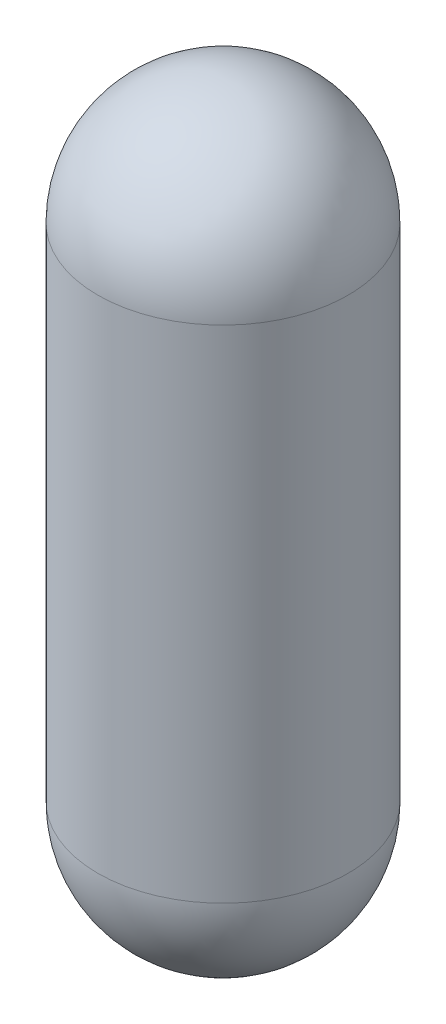
ISO-10303-21;
HEADER;
FILE_DESCRIPTION(('STEP AP214'),'2;1');
FILE_NAME('part.step','',(''),(''),'','','');
FILE_SCHEMA(('AUTOMOTIVE_DESIGN { 1 0 10303 214 1 1 1 1 }'));
ENDSEC;
DATA;
#1=APPLICATION_CONTEXT('core data for automotive mechanical design processes');
#2=APPLICATION_PROTOCOL_DEFINITION('international standard','automotive_design',2000,#1);
#3=PRODUCT_CONTEXT('',#1,'mechanical');
#4=PRODUCT('Part','Part','',(#3));
#5=PRODUCT_RELATED_PRODUCT_CATEGORY('part','',(#4));
#6=PRODUCT_DEFINITION_FORMATION('','',#4);
#7=PRODUCT_DEFINITION_CONTEXT('part definition',#1,'design');
#8=PRODUCT_DEFINITION('design','',#6,#7);
#9=PRODUCT_DEFINITION_SHAPE('','',#8);
#10=(LENGTH_UNIT() NAMED_UNIT(*) SI_UNIT(.MILLI.,.METRE.));
#11=(NAMED_UNIT(*) PLANE_ANGLE_UNIT() SI_UNIT($,.RADIAN.));
#12=(NAMED_UNIT(*) SI_UNIT($,.STERADIAN.) SOLID_ANGLE_UNIT());
#13=UNCERTAINTY_MEASURE_WITH_UNIT(LENGTH_MEASURE(1.E-05),#10,'distance_accuracy_value','');
#14=(GEOMETRIC_REPRESENTATION_CONTEXT(3) GLOBAL_UNCERTAINTY_ASSIGNED_CONTEXT((#13)) GLOBAL_UNIT_ASSIGNED_CONTEXT((#10,
#11,#12)) REPRESENTATION_CONTEXT('',''));
#15=CARTESIAN_POINT('',(0.,0.,0.));
#16=DIRECTION('',(0.,0.,1.));
#17=DIRECTION('',(1.,0.,0.));
#18=AXIS2_PLACEMENT_3D('',#15,#16,#17);
#19=CARTESIAN_POINT('',(0.,-101.6,0.));
#20=DIRECTION('',(0.,1.,0.));
#21=DIRECTION('',(0.,0.,1.));
#22=AXIS2_PLACEMENT_3D('',#19,#20,#21);
#23=CYLINDRICAL_SURFACE('',#22,50.8);
#24=CARTESIAN_POINT('',(0.,-101.6,0.));
#25=DIRECTION('',(0.,1.,0.));
#26=DIRECTION('',(0.,0.,1.));
#27=AXIS2_PLACEMENT_3D('',#24,#25,#26);
#28=CIRCLE('',#27,50.8);
#29=CARTESIAN_POINT('',(0.,-101.6,50.8));
#30=VERTEX_POINT('',#29);
#31=EDGE_CURVE('E37',#30,#30,#28,.T.);
#32=ORIENTED_EDGE('',*,*,#31,.T.);
#33=EDGE_LOOP('',(#32));
#34=FACE_BOUND('',#33,.T.);
#35=CARTESIAN_POINT('',(0.,101.6,0.));
#36=DIRECTION('',(0.,1.,0.));
#37=DIRECTION('',(0.,0.,1.));
#38=AXIS2_PLACEMENT_3D('',#35,#36,#37);
#39=CIRCLE('',#38,50.8);
#40=CARTESIAN_POINT('',(0.,101.6,50.8));
#41=VERTEX_POINT('',#40);
#42=EDGE_CURVE('E10',#41,#41,#39,.T.);
#43=ORIENTED_EDGE('',*,*,#42,.F.);
#44=EDGE_LOOP('',(#43));
#45=FACE_BOUND('',#44,.T.);
#46=ADVANCED_FACE('F31',(#34,#45),#23,.T.);
#47=CARTESIAN_POINT('',(0.,101.6,0.));
#48=DIRECTION('',(0.,1.,0.));
#49=DIRECTION('',(0.,0.,-1.));
#50=AXIS2_PLACEMENT_3D('',#47,#48,#49);
#51=SPHERICAL_SURFACE('',#50,50.8);
#52=ORIENTED_EDGE('',*,*,#42,.T.);
#53=EDGE_LOOP('',(#52));
#54=FACE_BOUND('',#53,.T.);
#55=ADVANCED_FACE('F47',(#54),#51,.T.);
#56=CARTESIAN_POINT('',(0.,-101.6,0.));
#57=DIRECTION('',(0.,-1.,0.));
#58=DIRECTION('',(0.,0.,-1.));
#59=AXIS2_PLACEMENT_3D('',#56,#57,#58);
#60=SPHERICAL_SURFACE('',#59,50.8);
#61=ORIENTED_EDGE('',*,*,#31,.F.);
#62=EDGE_LOOP('',(#61));
#63=FACE_BOUND('',#62,.T.);
#64=ADVANCED_FACE('F45',(#63),#60,.T.);
#65=CLOSED_SHELL('',(#46,#55,#64));
#66=MANIFOLD_SOLID_BREP('B2',#65);
#67=ADVANCED_BREP_SHAPE_REPRESENTATION('',(#18,#66),#14);
#68=SHAPE_DEFINITION_REPRESENTATION(#9,#67);
ENDSEC;
END-ISO-10303-21;
